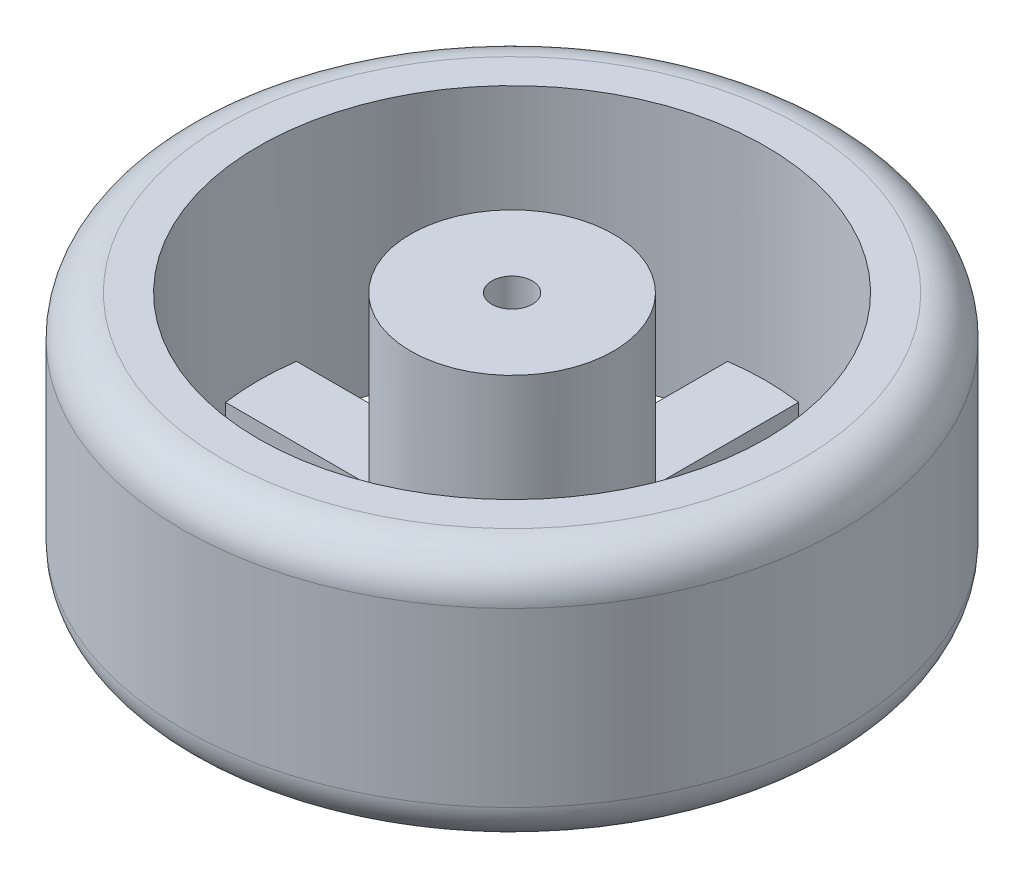
ISO-10303-21;
HEADER;
FILE_DESCRIPTION(('STEP AP214'),'2;1');
FILE_NAME('part.step','',(''),(''),'','','');
FILE_SCHEMA(('AUTOMOTIVE_DESIGN { 1 0 10303 214 1 1 1 1 }'));
ENDSEC;
DATA;
#1=APPLICATION_CONTEXT('core data for automotive mechanical design processes');
#2=APPLICATION_PROTOCOL_DEFINITION('international standard','automotive_design',2000,#1);
#3=PRODUCT_CONTEXT('',#1,'mechanical');
#4=PRODUCT('Part','Part','',(#3));
#5=PRODUCT_RELATED_PRODUCT_CATEGORY('part','',(#4));
#6=PRODUCT_DEFINITION_FORMATION('','',#4);
#7=PRODUCT_DEFINITION_CONTEXT('part definition',#1,'design');
#8=PRODUCT_DEFINITION('design','',#6,#7);
#9=PRODUCT_DEFINITION_SHAPE('','',#8);
#10=(LENGTH_UNIT() NAMED_UNIT(*) SI_UNIT(.MILLI.,.METRE.));
#11=(NAMED_UNIT(*) PLANE_ANGLE_UNIT() SI_UNIT($,.RADIAN.));
#12=(NAMED_UNIT(*) SI_UNIT($,.STERADIAN.) SOLID_ANGLE_UNIT());
#13=UNCERTAINTY_MEASURE_WITH_UNIT(LENGTH_MEASURE(1.E-05),#10,'distance_accuracy_value','');
#14=(GEOMETRIC_REPRESENTATION_CONTEXT(3) GLOBAL_UNCERTAINTY_ASSIGNED_CONTEXT((#13)) GLOBAL_UNIT_ASSIGNED_CONTEXT((#10,
#11,#12)) REPRESENTATION_CONTEXT('',''));
#15=CARTESIAN_POINT('',(0.,0.,0.));
#16=DIRECTION('',(0.,0.,1.));
#17=DIRECTION('',(1.,0.,0.));
#18=AXIS2_PLACEMENT_3D('',#15,#16,#17);
#19=CARTESIAN_POINT('',(0.,25.,0.));
#20=DIRECTION('',(0.,-1.,0.));
#21=DIRECTION('',(0.,0.,-1.));
#22=AXIS2_PLACEMENT_3D('',#19,#20,#21);
#23=CYLINDRICAL_SURFACE('',#22,25.);
#24=CARTESIAN_POINT('',(0.,25.,0.));
#25=DIRECTION('',(0.,1.,0.));
#26=DIRECTION('',(0.,0.,1.));
#27=AXIS2_PLACEMENT_3D('',#24,#25,#26);
#28=CIRCLE('',#27,25.);
#29=CARTESIAN_POINT('',(0.,25.,25.));
#30=VERTEX_POINT('',#29);
#31=EDGE_CURVE('E256',#30,#30,#28,.T.);
#32=ORIENTED_EDGE('',*,*,#31,.T.);
#33=EDGE_LOOP('',(#32));
#34=FACE_BOUND('',#33,.T.);
#35=CARTESIAN_POINT('',(0.,5.,0.));
#36=DIRECTION('',(0.,-1.,0.));
#37=DIRECTION('',(0.,0.,-1.));
#38=AXIS2_PLACEMENT_3D('',#35,#36,#37);
#39=CIRCLE('',#38,25.);
#40=CARTESIAN_POINT('',(24.7537875889731,5.,3.50000000000001));
#41=VERTEX_POINT('',#40);
#42=CARTESIAN_POINT('',(24.7537875889731,5.,-3.49999999999999));
#43=VERTEX_POINT('',#42);
#44=EDGE_CURVE('E157',#41,#43,#39,.F.);
#45=ORIENTED_EDGE('',*,*,#44,.F.);
#46=DIRECTION('',(0.,-1.,0.));
#47=VECTOR('',#46,1.);
#48=CARTESIAN_POINT('',(24.7537875889731,5.,3.50000000000001));
#49=LINE('',#48,#47);
#50=CARTESIAN_POINT('',(24.7537875889731,0.,3.50000000000001));
#51=VERTEX_POINT('',#50);
#52=EDGE_CURVE('E171',#41,#51,#49,.T.);
#53=ORIENTED_EDGE('',*,*,#52,.T.);
#54=CARTESIAN_POINT('',(0.,0.,0.));
#55=DIRECTION('',(0.,1.,0.));
#56=DIRECTION('',(0.,0.,1.));
#57=AXIS2_PLACEMENT_3D('',#54,#55,#56);
#58=CIRCLE('',#57,25.);
#59=CARTESIAN_POINT('',(3.49999999999999,0.,24.7537875889731));
#60=VERTEX_POINT('',#59);
#61=EDGE_CURVE('E260',#60,#51,#58,.T.);
#62=ORIENTED_EDGE('',*,*,#61,.F.);
#63=DIRECTION('',(0.,-1.,0.));
#64=VECTOR('',#63,1.);
#65=CARTESIAN_POINT('',(3.49999999999999,5.,24.7537875889731));
#66=LINE('',#65,#64);
#67=CARTESIAN_POINT('',(3.49999999999999,5.,24.7537875889731));
#68=VERTEX_POINT('',#67);
#69=EDGE_CURVE('E246',#68,#60,#66,.T.);
#70=ORIENTED_EDGE('',*,*,#69,.F.);
#71=CARTESIAN_POINT('',(0.,5.,0.));
#72=DIRECTION('',(0.,-1.,0.));
#73=DIRECTION('',(0.,0.,-1.));
#74=AXIS2_PLACEMENT_3D('',#71,#72,#73);
#75=CIRCLE('',#74,25.);
#76=CARTESIAN_POINT('',(-3.50000000000001,5.,24.7537875889731));
#77=VERTEX_POINT('',#76);
#78=EDGE_CURVE('E243',#77,#68,#75,.F.);
#79=ORIENTED_EDGE('',*,*,#78,.F.);
#80=DIRECTION('',(0.,-1.,0.));
#81=VECTOR('',#80,1.);
#82=CARTESIAN_POINT('',(-3.50000000000001,5.,24.7537875889731));
#83=LINE('',#82,#81);
#84=CARTESIAN_POINT('',(-3.50000000000001,0.,24.7537875889731));
#85=VERTEX_POINT('',#84);
#86=EDGE_CURVE('E250',#77,#85,#83,.T.);
#87=ORIENTED_EDGE('',*,*,#86,.T.);
#88=CARTESIAN_POINT('',(-24.7537875889731,0.,3.5));
#89=VERTEX_POINT('',#88);
#90=EDGE_CURVE('E253',#89,#85,#58,.T.);
#91=ORIENTED_EDGE('',*,*,#90,.F.);
#92=DIRECTION('',(0.,-1.,0.));
#93=VECTOR('',#92,1.);
#94=CARTESIAN_POINT('',(-24.7537875889731,5.,3.5));
#95=LINE('',#94,#93);
#96=CARTESIAN_POINT('',(-24.7537875889731,5.,3.5));
#97=VERTEX_POINT('',#96);
#98=EDGE_CURVE('E195',#97,#89,#95,.T.);
#99=ORIENTED_EDGE('',*,*,#98,.F.);
#100=CARTESIAN_POINT('',(0.,5.,0.));
#101=DIRECTION('',(0.,-1.,0.));
#102=DIRECTION('',(0.,0.,-1.));
#103=AXIS2_PLACEMENT_3D('',#100,#101,#102);
#104=CIRCLE('',#103,25.);
#105=CARTESIAN_POINT('',(-24.7537875889731,5.,-3.5));
#106=VERTEX_POINT('',#105);
#107=EDGE_CURVE('E180',#106,#97,#104,.F.);
#108=ORIENTED_EDGE('',*,*,#107,.F.);
#109=DIRECTION('',(0.,-1.,0.));
#110=VECTOR('',#109,1.);
#111=CARTESIAN_POINT('',(-24.7537875889731,5.,-3.5));
#112=LINE('',#111,#110);
#113=CARTESIAN_POINT('',(-24.7537875889731,0.,-3.5));
#114=VERTEX_POINT('',#113);
#115=EDGE_CURVE('E190',#106,#114,#112,.T.);
#116=ORIENTED_EDGE('',*,*,#115,.T.);
#117=CARTESIAN_POINT('',(-3.5,0.,-24.7537875889731));
#118=VERTEX_POINT('',#117);
#119=EDGE_CURVE('E263',#118,#114,#58,.T.);
#120=ORIENTED_EDGE('',*,*,#119,.F.);
#121=DIRECTION('',(0.,-1.,0.));
#122=VECTOR('',#121,1.);
#123=CARTESIAN_POINT('',(-3.5,5.,-24.7537875889731));
#124=LINE('',#123,#122);
#125=CARTESIAN_POINT('',(-3.5,5.,-24.7537875889731));
#126=VERTEX_POINT('',#125);
#127=EDGE_CURVE('E209',#126,#118,#124,.T.);
#128=ORIENTED_EDGE('',*,*,#127,.F.);
#129=CARTESIAN_POINT('',(0.,5.,0.));
#130=DIRECTION('',(0.,-1.,0.));
#131=DIRECTION('',(0.,0.,-1.));
#132=AXIS2_PLACEMENT_3D('',#129,#130,#131);
#133=CIRCLE('',#132,25.);
#134=CARTESIAN_POINT('',(3.5,5.,-24.7537875889731));
#135=VERTEX_POINT('',#134);
#136=EDGE_CURVE('E203',#135,#126,#133,.F.);
#137=ORIENTED_EDGE('',*,*,#136,.F.);
#138=DIRECTION('',(0.,-1.,0.));
#139=VECTOR('',#138,1.);
#140=CARTESIAN_POINT('',(3.5,5.,-24.7537875889731));
#141=LINE('',#140,#139);
#142=CARTESIAN_POINT('',(3.5,0.,-24.7537875889731));
#143=VERTEX_POINT('',#142);
#144=EDGE_CURVE('E214',#135,#143,#141,.T.);
#145=ORIENTED_EDGE('',*,*,#144,.T.);
#146=CARTESIAN_POINT('',(24.7537875889731,0.,-3.49999999999999));
#147=VERTEX_POINT('',#146);
#148=EDGE_CURVE('E170',#147,#143,#58,.T.);
#149=ORIENTED_EDGE('',*,*,#148,.F.);
#150=DIRECTION('',(0.,-1.,0.));
#151=VECTOR('',#150,1.);
#152=CARTESIAN_POINT('',(24.7537875889731,5.,-3.49999999999999));
#153=LINE('',#152,#151);
#154=EDGE_CURVE('E153',#43,#147,#153,.T.);
#155=ORIENTED_EDGE('',*,*,#154,.F.);
#156=EDGE_LOOP('',(#45,#53,#62,#70,#79,#87,#91,#99,#108,#116,#120,#128,#137,#145,#149,#155));
#157=FACE_BOUND('',#156,.T.);
#158=ADVANCED_FACE('F37',(#34,#157),#23,.F.);
#159=CARTESIAN_POINT('',(0.,0.,0.));
#160=DIRECTION('',(0.,1.,0.));
#161=DIRECTION('',(0.,0.,1.));
#162=AXIS2_PLACEMENT_3D('',#159,#160,#161);
#163=CYLINDRICAL_SURFACE('',#162,10.);
#164=CARTESIAN_POINT('',(0.,25.,0.));
#165=DIRECTION('',(0.,1.,0.));
#166=DIRECTION('',(0.,0.,1.));
#167=AXIS2_PLACEMENT_3D('',#164,#165,#166);
#168=CIRCLE('',#167,10.);
#169=CARTESIAN_POINT('',(0.,25.,10.));
#170=VERTEX_POINT('',#169);
#171=EDGE_CURVE('E222',#170,#170,#168,.T.);
#172=ORIENTED_EDGE('',*,*,#171,.F.);
#173=EDGE_LOOP('',(#172));
#174=FACE_BOUND('',#173,.T.);
#175=CARTESIAN_POINT('',(0.,0.,0.));
#176=DIRECTION('',(0.,1.,0.));
#177=DIRECTION('',(0.,0.,1.));
#178=AXIS2_PLACEMENT_3D('',#175,#176,#177);
#179=CIRCLE('',#178,10.);
#180=CARTESIAN_POINT('',(3.5,0.,9.3674969975976));
#181=VERTEX_POINT('',#180);
#182=CARTESIAN_POINT('',(9.3674969975976,0.,3.5));
#183=VERTEX_POINT('',#182);
#184=EDGE_CURVE('E225',#181,#183,#179,.T.);
#185=ORIENTED_EDGE('',*,*,#184,.T.);
#186=DIRECTION('',(0.,1.,0.));
#187=VECTOR('',#186,1.);
#188=CARTESIAN_POINT('',(9.3674969975976,0.,3.5));
#189=LINE('',#188,#187);
#190=CARTESIAN_POINT('',(9.3674969975976,5.,3.5));
#191=VERTEX_POINT('',#190);
#192=EDGE_CURVE('E57',#183,#191,#189,.T.);
#193=ORIENTED_EDGE('',*,*,#192,.T.);
#194=CARTESIAN_POINT('',(0.,5.,0.));
#195=DIRECTION('',(0.,-1.,0.));
#196=DIRECTION('',(0.,0.,-1.));
#197=AXIS2_PLACEMENT_3D('',#194,#195,#196);
#198=CIRCLE('',#197,10.);
#199=CARTESIAN_POINT('',(9.3674969975976,5.,-3.5));
#200=VERTEX_POINT('',#199);
#201=EDGE_CURVE('E52',#191,#200,#198,.F.);
#202=ORIENTED_EDGE('',*,*,#201,.T.);
#203=DIRECTION('',(0.,1.,0.));
#204=VECTOR('',#203,1.);
#205=CARTESIAN_POINT('',(9.3674969975976,0.,-3.5));
#206=LINE('',#205,#204);
#207=CARTESIAN_POINT('',(9.3674969975976,0.,-3.5));
#208=VERTEX_POINT('',#207);
#209=EDGE_CURVE('E155',#208,#200,#206,.T.);
#210=ORIENTED_EDGE('',*,*,#209,.F.);
#211=CARTESIAN_POINT('',(3.5,0.,-9.3674969975976));
#212=VERTEX_POINT('',#211);
#213=EDGE_CURVE('E228',#208,#212,#179,.T.);
#214=ORIENTED_EDGE('',*,*,#213,.T.);
#215=DIRECTION('',(0.,1.,0.));
#216=VECTOR('',#215,1.);
#217=CARTESIAN_POINT('',(3.5,0.,-9.3674969975976));
#218=LINE('',#217,#216);
#219=CARTESIAN_POINT('',(3.5,5.,-9.3674969975976));
#220=VERTEX_POINT('',#219);
#221=EDGE_CURVE('E271',#220,#212,#218,.F.);
#222=ORIENTED_EDGE('',*,*,#221,.F.);
#223=CARTESIAN_POINT('',(0.,5.,0.));
#224=DIRECTION('',(0.,-1.,0.));
#225=DIRECTION('',(0.,0.,-1.));
#226=AXIS2_PLACEMENT_3D('',#223,#224,#225);
#227=CIRCLE('',#226,10.);
#228=CARTESIAN_POINT('',(-3.5,5.,-9.3674969975976));
#229=VERTEX_POINT('',#228);
#230=EDGE_CURVE('E266',#220,#229,#227,.F.);
#231=ORIENTED_EDGE('',*,*,#230,.T.);
#232=DIRECTION('',(0.,1.,0.));
#233=VECTOR('',#232,1.);
#234=CARTESIAN_POINT('',(-3.5,0.,-9.3674969975976));
#235=LINE('',#234,#233);
#236=CARTESIAN_POINT('',(-3.5,0.,-9.3674969975976));
#237=VERTEX_POINT('',#236);
#238=EDGE_CURVE('E268',#229,#237,#235,.F.);
#239=ORIENTED_EDGE('',*,*,#238,.T.);
#240=CARTESIAN_POINT('',(-9.3674969975976,0.,-3.5));
#241=VERTEX_POINT('',#240);
#242=EDGE_CURVE('E229',#237,#241,#179,.T.);
#243=ORIENTED_EDGE('',*,*,#242,.T.);
#244=DIRECTION('',(0.,1.,0.));
#245=VECTOR('',#244,1.);
#246=CARTESIAN_POINT('',(-9.3674969975976,0.,-3.5));
#247=LINE('',#246,#245);
#248=CARTESIAN_POINT('',(-9.3674969975976,5.,-3.5));
#249=VERTEX_POINT('',#248);
#250=EDGE_CURVE('E276',#249,#241,#247,.F.);
#251=ORIENTED_EDGE('',*,*,#250,.F.);
#252=CARTESIAN_POINT('',(0.,5.,0.));
#253=DIRECTION('',(0.,-1.,0.));
#254=DIRECTION('',(0.,0.,-1.));
#255=AXIS2_PLACEMENT_3D('',#252,#253,#254);
#256=CIRCLE('',#255,10.);
#257=CARTESIAN_POINT('',(-9.3674969975976,5.,3.5));
#258=VERTEX_POINT('',#257);
#259=EDGE_CURVE('E274',#249,#258,#256,.F.);
#260=ORIENTED_EDGE('',*,*,#259,.T.);
#261=DIRECTION('',(0.,1.,0.));
#262=VECTOR('',#261,1.);
#263=CARTESIAN_POINT('',(-9.3674969975976,0.,3.5));
#264=LINE('',#263,#262);
#265=CARTESIAN_POINT('',(-9.3674969975976,0.,3.5));
#266=VERTEX_POINT('',#265);
#267=EDGE_CURVE('E279',#258,#266,#264,.F.);
#268=ORIENTED_EDGE('',*,*,#267,.T.);
#269=CARTESIAN_POINT('',(-3.5,0.,9.3674969975976));
#270=VERTEX_POINT('',#269);
#271=EDGE_CURVE('E232',#266,#270,#179,.T.);
#272=ORIENTED_EDGE('',*,*,#271,.T.);
#273=DIRECTION('',(0.,1.,0.));
#274=VECTOR('',#273,1.);
#275=CARTESIAN_POINT('',(-3.5,0.,9.3674969975976));
#276=LINE('',#275,#274);
#277=CARTESIAN_POINT('',(-3.5,5.,9.3674969975976));
#278=VERTEX_POINT('',#277);
#279=EDGE_CURVE('E234',#278,#270,#276,.F.);
#280=ORIENTED_EDGE('',*,*,#279,.F.);
#281=CARTESIAN_POINT('',(0.,5.,0.));
#282=DIRECTION('',(0.,-1.,0.));
#283=DIRECTION('',(0.,0.,-1.));
#284=AXIS2_PLACEMENT_3D('',#281,#282,#283);
#285=CIRCLE('',#284,10.);
#286=CARTESIAN_POINT('',(3.5,5.,9.3674969975976));
#287=VERTEX_POINT('',#286);
#288=EDGE_CURVE('E259',#287,#278,#285,.T.);
#289=ORIENTED_EDGE('',*,*,#288,.F.);
#290=DIRECTION('',(0.,1.,0.));
#291=VECTOR('',#290,1.);
#292=CARTESIAN_POINT('',(3.5,0.,9.3674969975976));
#293=LINE('',#292,#291);
#294=EDGE_CURVE('E227',#287,#181,#293,.F.);
#295=ORIENTED_EDGE('',*,*,#294,.T.);
#296=EDGE_LOOP('',(#185,#193,#202,#210,#214,#222,#231,#239,#243,#251,#260,#268,#272,#280,#289,#295));
#297=FACE_BOUND('',#296,.T.);
#298=ADVANCED_FACE('F303',(#174,#297),#163,.T.);
#299=CARTESIAN_POINT('',(0.,25.,0.));
#300=DIRECTION('',(0.,1.,0.));
#301=DIRECTION('',(0.,0.,1.));
#302=AXIS2_PLACEMENT_3D('',#299,#300,#301);
#303=PLANE('',#302);
#304=CARTESIAN_POINT('',(0.,25.,0.));
#305=DIRECTION('',(0.,1.,0.));
#306=DIRECTION('',(0.,0.,1.));
#307=AXIS2_PLACEMENT_3D('',#304,#305,#306);
#308=CIRCLE('',#307,28.5);
#309=CARTESIAN_POINT('',(0.,25.,28.5));
#310=VERTEX_POINT('',#309);
#311=EDGE_CURVE('E283',#310,#310,#308,.T.);
#312=ORIENTED_EDGE('',*,*,#311,.T.);
#313=EDGE_LOOP('',(#312));
#314=FACE_BOUND('',#313,.T.);
#315=ORIENTED_EDGE('',*,*,#31,.F.);
#316=EDGE_LOOP('',(#315));
#317=FACE_BOUND('',#316,.T.);
#318=ADVANCED_FACE('F299',(#314,#317),#303,.T.);
#319=CARTESIAN_POINT('',(0.,0.,0.));
#320=DIRECTION('',(0.,1.,0.));
#321=DIRECTION('',(0.,0.,1.));
#322=AXIS2_PLACEMENT_3D('',#319,#320,#321);
#323=PLANE('',#322);
#324=CARTESIAN_POINT('',(0.,0.,0.));
#325=DIRECTION('',(0.,1.,0.));
#326=DIRECTION('',(0.,0.,1.));
#327=AXIS2_PLACEMENT_3D('',#324,#325,#326);
#328=CIRCLE('',#327,28.5);
#329=CARTESIAN_POINT('',(0.,0.,28.5));
#330=VERTEX_POINT('',#329);
#331=EDGE_CURVE('E11',#330,#330,#328,.F.);
#332=ORIENTED_EDGE('',*,*,#331,.T.);
#333=EDGE_LOOP('',(#332));
#334=FACE_BOUND('',#333,.T.);
#335=ORIENTED_EDGE('',*,*,#213,.F.);
#336=DIRECTION('',(1.,0.,0.));
#337=VECTOR('',#336,1.);
#338=CARTESIAN_POINT('',(0.,0.,-3.5));
#339=LINE('',#338,#337);
#340=EDGE_CURVE('E356',#208,#147,#339,.T.);
#341=ORIENTED_EDGE('',*,*,#340,.T.);
#342=ORIENTED_EDGE('',*,*,#148,.T.);
#343=DIRECTION('',(0.,0.,1.));
#344=VECTOR('',#343,1.);
#345=CARTESIAN_POINT('',(3.5,0.,0.));
#346=LINE('',#345,#344);
#347=EDGE_CURVE('E204',#143,#212,#346,.T.);
#348=ORIENTED_EDGE('',*,*,#347,.T.);
#349=EDGE_LOOP('',(#335,#341,#342,#348));
#350=FACE_BOUND('',#349,.T.);
#351=DIRECTION('',(1.,0.,0.));
#352=VECTOR('',#351,1.);
#353=CARTESIAN_POINT('',(0.,0.,3.5));
#354=LINE('',#353,#352);
#355=EDGE_CURVE('E158',#183,#51,#354,.T.);
#356=ORIENTED_EDGE('',*,*,#355,.F.);
#357=ORIENTED_EDGE('',*,*,#184,.F.);
#358=DIRECTION('',(0.,0.,1.));
#359=VECTOR('',#358,1.);
#360=CARTESIAN_POINT('',(3.5,0.,0.));
#361=LINE('',#360,#359);
#362=EDGE_CURVE('E241',#181,#60,#361,.T.);
#363=ORIENTED_EDGE('',*,*,#362,.T.);
#364=ORIENTED_EDGE('',*,*,#61,.T.);
#365=EDGE_LOOP('',(#356,#357,#363,#364));
#366=FACE_BOUND('',#365,.T.);
#367=ORIENTED_EDGE('',*,*,#119,.T.);
#368=DIRECTION('',(1.,0.,0.));
#369=VECTOR('',#368,1.);
#370=CARTESIAN_POINT('',(0.,0.,-3.5));
#371=LINE('',#370,#369);
#372=EDGE_CURVE('E179',#114,#241,#371,.T.);
#373=ORIENTED_EDGE('',*,*,#372,.T.);
#374=ORIENTED_EDGE('',*,*,#242,.F.);
#375=DIRECTION('',(0.,0.,1.));
#376=VECTOR('',#375,1.);
#377=CARTESIAN_POINT('',(-3.5,0.,0.));
#378=LINE('',#377,#376);
#379=EDGE_CURVE('E197',#118,#237,#378,.T.);
#380=ORIENTED_EDGE('',*,*,#379,.F.);
#381=EDGE_LOOP('',(#367,#373,#374,#380));
#382=FACE_BOUND('',#381,.T.);
#383=DIRECTION('',(1.,0.,0.));
#384=VECTOR('',#383,1.);
#385=CARTESIAN_POINT('',(0.,0.,3.5));
#386=LINE('',#385,#384);
#387=EDGE_CURVE('E184',#89,#266,#386,.T.);
#388=ORIENTED_EDGE('',*,*,#387,.F.);
#389=ORIENTED_EDGE('',*,*,#90,.T.);
#390=DIRECTION('',(0.,0.,1.));
#391=VECTOR('',#390,1.);
#392=CARTESIAN_POINT('',(-3.5,0.,0.));
#393=LINE('',#392,#391);
#394=EDGE_CURVE('E237',#270,#85,#393,.T.);
#395=ORIENTED_EDGE('',*,*,#394,.F.);
#396=ORIENTED_EDGE('',*,*,#271,.F.);
#397=EDGE_LOOP('',(#388,#389,#395,#396));
#398=FACE_BOUND('',#397,.T.);
#399=ADVANCED_FACE('F302',(#334,#350,#366,#382,#398),#323,.F.);
#400=CARTESIAN_POINT('',(0.,25.,0.));
#401=DIRECTION('',(0.,-1.,0.));
#402=DIRECTION('',(0.,0.,-1.));
#403=AXIS2_PLACEMENT_3D('',#400,#401,#402);
#404=CYLINDRICAL_SURFACE('',#403,32.5);
#405=CARTESIAN_POINT('',(0.,21.,0.));
#406=DIRECTION('',(0.,1.,0.));
#407=DIRECTION('',(0.,0.,1.));
#408=AXIS2_PLACEMENT_3D('',#405,#406,#407);
#409=CIRCLE('',#408,32.5);
#410=CARTESIAN_POINT('',(0.,21.,32.5));
#411=VERTEX_POINT('',#410);
#412=EDGE_CURVE('E45',#411,#411,#409,.F.);
#413=ORIENTED_EDGE('',*,*,#412,.T.);
#414=EDGE_LOOP('',(#413));
#415=FACE_BOUND('',#414,.T.);
#416=CARTESIAN_POINT('',(0.,4.,0.));
#417=DIRECTION('',(0.,1.,0.));
#418=DIRECTION('',(0.,0.,1.));
#419=AXIS2_PLACEMENT_3D('',#416,#417,#418);
#420=CIRCLE('',#419,32.5);
#421=CARTESIAN_POINT('',(0.,4.,32.5));
#422=VERTEX_POINT('',#421);
#423=EDGE_CURVE('E286',#422,#422,#420,.T.);
#424=ORIENTED_EDGE('',*,*,#423,.T.);
#425=EDGE_LOOP('',(#424));
#426=FACE_BOUND('',#425,.T.);
#427=ADVANCED_FACE('F291',(#415,#426),#404,.T.);
#428=CARTESIAN_POINT('',(-3.5,5.,0.));
#429=DIRECTION('',(1.,0.,0.));
#430=DIRECTION('',(0.,0.,-1.));
#431=AXIS2_PLACEMENT_3D('',#428,#429,#430);
#432=PLANE('',#431);
#433=DIRECTION('',(0.,0.,1.));
#434=VECTOR('',#433,1.);
#435=CARTESIAN_POINT('',(-3.5,5.,0.));
#436=LINE('',#435,#434);
#437=EDGE_CURVE('E238',#278,#77,#436,.T.);
#438=ORIENTED_EDGE('',*,*,#437,.F.);
#439=ORIENTED_EDGE('',*,*,#279,.T.);
#440=ORIENTED_EDGE('',*,*,#394,.T.);
#441=ORIENTED_EDGE('',*,*,#86,.F.);
#442=EDGE_LOOP('',(#438,#439,#440,#441));
#443=FACE_BOUND('',#442,.T.);
#444=ADVANCED_FACE('F315',(#443),#432,.F.);
#445=CARTESIAN_POINT('',(3.5,5.,0.));
#446=DIRECTION('',(1.,0.,0.));
#447=DIRECTION('',(0.,0.,-1.));
#448=AXIS2_PLACEMENT_3D('',#445,#446,#447);
#449=PLANE('',#448);
#450=ORIENTED_EDGE('',*,*,#294,.F.);
#451=DIRECTION('',(0.,0.,1.));
#452=VECTOR('',#451,1.);
#453=CARTESIAN_POINT('',(3.5,5.,0.));
#454=LINE('',#453,#452);
#455=EDGE_CURVE('E240',#287,#68,#454,.T.);
#456=ORIENTED_EDGE('',*,*,#455,.T.);
#457=ORIENTED_EDGE('',*,*,#69,.T.);
#458=ORIENTED_EDGE('',*,*,#362,.F.);
#459=EDGE_LOOP('',(#450,#456,#457,#458));
#460=FACE_BOUND('',#459,.T.);
#461=ADVANCED_FACE('F325',(#460),#449,.T.);
#462=CARTESIAN_POINT('',(0.,5.,0.));
#463=DIRECTION('',(0.,-1.,0.));
#464=DIRECTION('',(0.,0.,-1.));
#465=AXIS2_PLACEMENT_3D('',#462,#463,#464);
#466=PLANE('',#465);
#467=ORIENTED_EDGE('',*,*,#455,.F.);
#468=ORIENTED_EDGE('',*,*,#288,.T.);
#469=ORIENTED_EDGE('',*,*,#437,.T.);
#470=ORIENTED_EDGE('',*,*,#78,.T.);
#471=EDGE_LOOP('',(#467,#468,#469,#470));
#472=FACE_BOUND('',#471,.T.);
#473=ADVANCED_FACE('F330',(#472),#466,.F.);
#474=CARTESIAN_POINT('',(0.,25.,0.));
#475=DIRECTION('',(0.,1.,0.));
#476=DIRECTION('',(0.,0.,1.));
#477=AXIS2_PLACEMENT_3D('',#474,#475,#476);
#478=PLANE('',#477);
#479=CARTESIAN_POINT('',(0.,25.,0.));
#480=DIRECTION('',(0.,1.,0.));
#481=DIRECTION('',(0.,0.,1.));
#482=AXIS2_PLACEMENT_3D('',#479,#480,#481);
#483=CIRCLE('',#482,2.);
#484=CARTESIAN_POINT('',(0.,25.,2.));
#485=VERTEX_POINT('',#484);
#486=EDGE_CURVE('E216',#485,#485,#483,.T.);
#487=ORIENTED_EDGE('',*,*,#486,.F.);
#488=EDGE_LOOP('',(#487));
#489=FACE_BOUND('',#488,.T.);
#490=ORIENTED_EDGE('',*,*,#171,.T.);
#491=EDGE_LOOP('',(#490));
#492=FACE_BOUND('',#491,.T.);
#493=ADVANCED_FACE('F401',(#489,#492),#478,.T.);
#494=CARTESIAN_POINT('',(0.,15.,0.));
#495=DIRECTION('',(0.,1.,0.));
#496=DIRECTION('',(0.,0.,1.));
#497=AXIS2_PLACEMENT_3D('',#494,#495,#496);
#498=CYLINDRICAL_SURFACE('',#497,2.);
#499=CARTESIAN_POINT('',(0.,15.,0.));
#500=DIRECTION('',(0.,1.,0.));
#501=DIRECTION('',(0.,0.,1.));
#502=AXIS2_PLACEMENT_3D('',#499,#500,#501);
#503=CIRCLE('',#502,2.);
#504=CARTESIAN_POINT('',(0.,15.,2.));
#505=VERTEX_POINT('',#504);
#506=EDGE_CURVE('E219',#505,#505,#503,.T.);
#507=ORIENTED_EDGE('',*,*,#506,.F.);
#508=EDGE_LOOP('',(#507));
#509=FACE_BOUND('',#508,.T.);
#510=ORIENTED_EDGE('',*,*,#486,.T.);
#511=EDGE_LOOP('',(#510));
#512=FACE_BOUND('',#511,.T.);
#513=ADVANCED_FACE('F397',(#509,#512),#498,.F.);
#514=CARTESIAN_POINT('',(0.,15.,0.));
#515=DIRECTION('',(0.,1.,0.));
#516=DIRECTION('',(0.,0.,1.));
#517=AXIS2_PLACEMENT_3D('',#514,#515,#516);
#518=PLANE('',#517);
#519=ORIENTED_EDGE('',*,*,#506,.T.);
#520=EDGE_LOOP('',(#519));
#521=FACE_BOUND('',#520,.T.);
#522=ADVANCED_FACE('F392',(#521),#518,.T.);
#523=CARTESIAN_POINT('',(3.5,5.,0.));
#524=DIRECTION('',(1.,0.,0.));
#525=DIRECTION('',(0.,0.,-1.));
#526=AXIS2_PLACEMENT_3D('',#523,#524,#525);
#527=PLANE('',#526);
#528=DIRECTION('',(0.,0.,1.));
#529=VECTOR('',#528,1.);
#530=CARTESIAN_POINT('',(3.5,5.,0.));
#531=LINE('',#530,#529);
#532=EDGE_CURVE('E206',#135,#220,#531,.T.);
#533=ORIENTED_EDGE('',*,*,#532,.T.);
#534=ORIENTED_EDGE('',*,*,#221,.T.);
#535=ORIENTED_EDGE('',*,*,#347,.F.);
#536=ORIENTED_EDGE('',*,*,#144,.F.);
#537=EDGE_LOOP('',(#533,#534,#535,#536));
#538=FACE_BOUND('',#537,.T.);
#539=ADVANCED_FACE('F358',(#538),#527,.T.);
#540=CARTESIAN_POINT('',(-3.5,5.,0.));
#541=DIRECTION('',(1.,0.,0.));
#542=DIRECTION('',(0.,0.,-1.));
#543=AXIS2_PLACEMENT_3D('',#540,#541,#542);
#544=PLANE('',#543);
#545=ORIENTED_EDGE('',*,*,#238,.F.);
#546=DIRECTION('',(0.,0.,1.));
#547=VECTOR('',#546,1.);
#548=CARTESIAN_POINT('',(-3.5,5.,0.));
#549=LINE('',#548,#547);
#550=EDGE_CURVE('E200',#126,#229,#549,.T.);
#551=ORIENTED_EDGE('',*,*,#550,.F.);
#552=ORIENTED_EDGE('',*,*,#127,.T.);
#553=ORIENTED_EDGE('',*,*,#379,.T.);
#554=EDGE_LOOP('',(#545,#551,#552,#553));
#555=FACE_BOUND('',#554,.T.);
#556=ADVANCED_FACE('F369',(#555),#544,.F.);
#557=CARTESIAN_POINT('',(0.,5.,0.));
#558=DIRECTION('',(0.,-1.,0.));
#559=DIRECTION('',(0.,0.,-1.));
#560=AXIS2_PLACEMENT_3D('',#557,#558,#559);
#561=PLANE('',#560);
#562=ORIENTED_EDGE('',*,*,#230,.F.);
#563=ORIENTED_EDGE('',*,*,#532,.F.);
#564=ORIENTED_EDGE('',*,*,#136,.T.);
#565=ORIENTED_EDGE('',*,*,#550,.T.);
#566=EDGE_LOOP('',(#562,#563,#564,#565));
#567=FACE_BOUND('',#566,.T.);
#568=ADVANCED_FACE('F366',(#567),#561,.F.);
#569=CARTESIAN_POINT('',(0.,5.,3.5));
#570=DIRECTION('',(0.,0.,-1.));
#571=DIRECTION('',(-1.,0.,0.));
#572=AXIS2_PLACEMENT_3D('',#569,#570,#571);
#573=PLANE('',#572);
#574=ORIENTED_EDGE('',*,*,#267,.F.);
#575=DIRECTION('',(1.,0.,0.));
#576=VECTOR('',#575,1.);
#577=CARTESIAN_POINT('',(0.,5.,3.5));
#578=LINE('',#577,#576);
#579=EDGE_CURVE('E187',#97,#258,#578,.T.);
#580=ORIENTED_EDGE('',*,*,#579,.F.);
#581=ORIENTED_EDGE('',*,*,#98,.T.);
#582=ORIENTED_EDGE('',*,*,#387,.T.);
#583=EDGE_LOOP('',(#574,#580,#581,#582));
#584=FACE_BOUND('',#583,.T.);
#585=ADVANCED_FACE('F372',(#584),#573,.F.);
#586=CARTESIAN_POINT('',(0.,5.,-3.5));
#587=DIRECTION('',(0.,0.,-1.));
#588=DIRECTION('',(-1.,0.,0.));
#589=AXIS2_PLACEMENT_3D('',#586,#587,#588);
#590=PLANE('',#589);
#591=DIRECTION('',(1.,0.,0.));
#592=VECTOR('',#591,1.);
#593=CARTESIAN_POINT('',(0.,5.,-3.5));
#594=LINE('',#593,#592);
#595=EDGE_CURVE('E183',#106,#249,#594,.T.);
#596=ORIENTED_EDGE('',*,*,#595,.T.);
#597=ORIENTED_EDGE('',*,*,#250,.T.);
#598=ORIENTED_EDGE('',*,*,#372,.F.);
#599=ORIENTED_EDGE('',*,*,#115,.F.);
#600=EDGE_LOOP('',(#596,#597,#598,#599));
#601=FACE_BOUND('',#600,.T.);
#602=ADVANCED_FACE('F378',(#601),#590,.T.);
#603=CARTESIAN_POINT('',(0.,5.,0.));
#604=DIRECTION('',(0.,-1.,0.));
#605=DIRECTION('',(0.,0.,-1.));
#606=AXIS2_PLACEMENT_3D('',#603,#604,#605);
#607=PLANE('',#606);
#608=ORIENTED_EDGE('',*,*,#259,.F.);
#609=ORIENTED_EDGE('',*,*,#595,.F.);
#610=ORIENTED_EDGE('',*,*,#107,.T.);
#611=ORIENTED_EDGE('',*,*,#579,.T.);
#612=EDGE_LOOP('',(#608,#609,#610,#611));
#613=FACE_BOUND('',#612,.T.);
#614=ADVANCED_FACE('F376',(#613),#607,.F.);
#615=CARTESIAN_POINT('',(0.,5.,3.5));
#616=DIRECTION('',(0.,0.,-1.));
#617=DIRECTION('',(-1.,0.,0.));
#618=AXIS2_PLACEMENT_3D('',#615,#616,#617);
#619=PLANE('',#618);
#620=ORIENTED_EDGE('',*,*,#192,.F.);
#621=ORIENTED_EDGE('',*,*,#355,.T.);
#622=ORIENTED_EDGE('',*,*,#52,.F.);
#623=DIRECTION('',(1.,0.,0.));
#624=VECTOR('',#623,1.);
#625=CARTESIAN_POINT('',(0.,5.,3.5));
#626=LINE('',#625,#624);
#627=EDGE_CURVE('E163',#191,#41,#626,.T.);
#628=ORIENTED_EDGE('',*,*,#627,.F.);
#629=EDGE_LOOP('',(#620,#621,#622,#628));
#630=FACE_BOUND('',#629,.T.);
#631=ADVANCED_FACE('F347',(#630),#619,.F.);
#632=CARTESIAN_POINT('',(0.,5.,-3.5));
#633=DIRECTION('',(0.,0.,-1.));
#634=DIRECTION('',(-1.,0.,0.));
#635=AXIS2_PLACEMENT_3D('',#632,#633,#634);
#636=PLANE('',#635);
#637=ORIENTED_EDGE('',*,*,#340,.F.);
#638=ORIENTED_EDGE('',*,*,#209,.T.);
#639=DIRECTION('',(1.,0.,0.));
#640=VECTOR('',#639,1.);
#641=CARTESIAN_POINT('',(0.,5.,-3.5));
#642=LINE('',#641,#640);
#643=EDGE_CURVE('E148',#200,#43,#642,.T.);
#644=ORIENTED_EDGE('',*,*,#643,.T.);
#645=ORIENTED_EDGE('',*,*,#154,.T.);
#646=EDGE_LOOP('',(#637,#638,#644,#645));
#647=FACE_BOUND('',#646,.T.);
#648=ADVANCED_FACE('F151',(#647),#636,.T.);
#649=CARTESIAN_POINT('',(0.,5.,0.));
#650=DIRECTION('',(0.,-1.,0.));
#651=DIRECTION('',(0.,0.,-1.));
#652=AXIS2_PLACEMENT_3D('',#649,#650,#651);
#653=PLANE('',#652);
#654=ORIENTED_EDGE('',*,*,#201,.F.);
#655=ORIENTED_EDGE('',*,*,#627,.T.);
#656=ORIENTED_EDGE('',*,*,#44,.T.);
#657=ORIENTED_EDGE('',*,*,#643,.F.);
#658=EDGE_LOOP('',(#654,#655,#656,#657));
#659=FACE_BOUND('',#658,.T.);
#660=ADVANCED_FACE('F161',(#659),#653,.F.);
#661=CARTESIAN_POINT('',(0.,21.,0.));
#662=DIRECTION('',(0.,1.,0.));
#663=DIRECTION('',(0.,0.,1.));
#664=AXIS2_PLACEMENT_3D('',#661,#662,#663);
#665=TOROIDAL_SURFACE('',#664,28.5,4.);
#666=ORIENTED_EDGE('',*,*,#412,.F.);
#667=EDGE_LOOP('',(#666));
#668=FACE_BOUND('',#667,.T.);
#669=ORIENTED_EDGE('',*,*,#311,.F.);
#670=EDGE_LOOP('',(#669));
#671=FACE_BOUND('',#670,.T.);
#672=ADVANCED_FACE('F294',(#668,#671),#665,.T.);
#673=CARTESIAN_POINT('',(0.,4.,0.));
#674=DIRECTION('',(0.,1.,0.));
#675=DIRECTION('',(0.,0.,1.));
#676=AXIS2_PLACEMENT_3D('',#673,#674,#675);
#677=TOROIDAL_SURFACE('',#676,28.5,4.);
#678=ORIENTED_EDGE('',*,*,#331,.F.);
#679=EDGE_LOOP('',(#678));
#680=FACE_BOUND('',#679,.T.);
#681=ORIENTED_EDGE('',*,*,#423,.F.);
#682=EDGE_LOOP('',(#681));
#683=FACE_BOUND('',#682,.T.);
#684=ADVANCED_FACE('F39',(#680,#683),#677,.T.);
#685=CLOSED_SHELL('',(#158,#298,#318,#399,#427,#444,#461,#473,#493,#513,#522,#539,#556,#568,
#585,#602,#614,#631,#648,#660,#672,#684));
#686=MANIFOLD_SOLID_BREP('B2',#685);
#687=ADVANCED_BREP_SHAPE_REPRESENTATION('',(#18,#686),#14);
#688=SHAPE_DEFINITION_REPRESENTATION(#9,#687);
ENDSEC;
END-ISO-10303-21;
